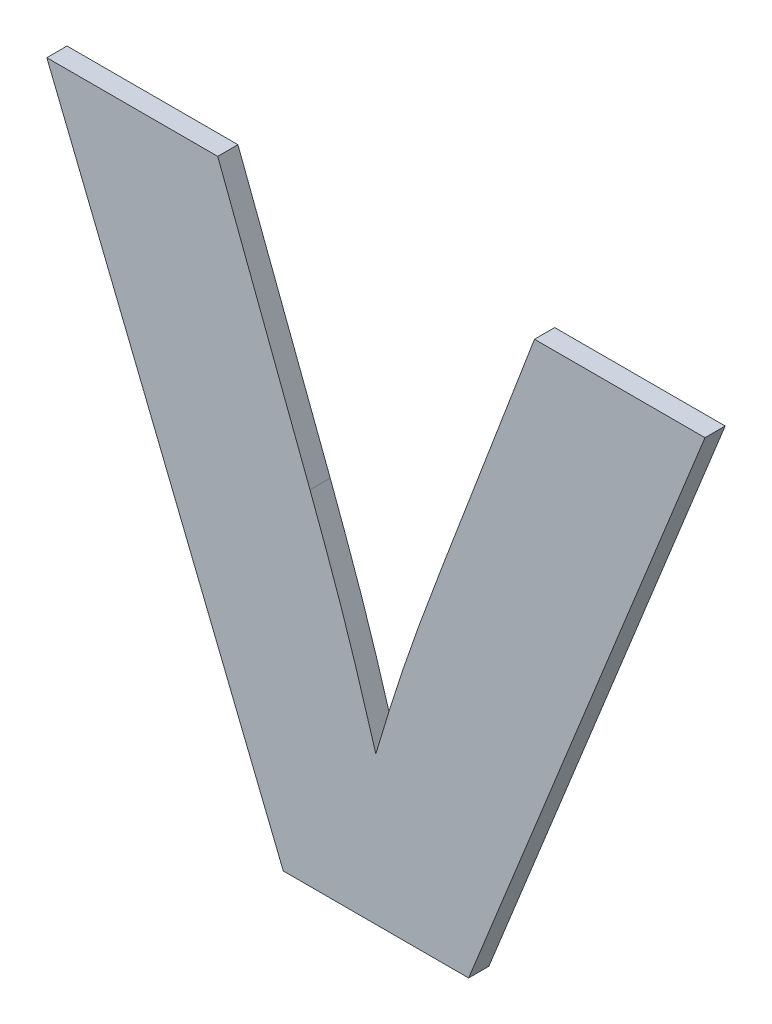
ISO-10303-21;
HEADER;
FILE_DESCRIPTION(('STEP AP214'),'2;1');
FILE_NAME('part.step','',(''),(''),'','','');
FILE_SCHEMA(('AUTOMOTIVE_DESIGN { 1 0 10303 214 1 1 1 1 }'));
ENDSEC;
DATA;
#1=APPLICATION_CONTEXT('core data for automotive mechanical design processes');
#2=APPLICATION_PROTOCOL_DEFINITION('international standard','automotive_design',2000,#1);
#3=PRODUCT_CONTEXT('',#1,'mechanical');
#4=PRODUCT('Part','Part','',(#3));
#5=PRODUCT_RELATED_PRODUCT_CATEGORY('part','',(#4));
#6=PRODUCT_DEFINITION_FORMATION('','',#4);
#7=PRODUCT_DEFINITION_CONTEXT('part definition',#1,'design');
#8=PRODUCT_DEFINITION('design','',#6,#7);
#9=PRODUCT_DEFINITION_SHAPE('','',#8);
#10=(LENGTH_UNIT() NAMED_UNIT(*) SI_UNIT(.MILLI.,.METRE.));
#11=(NAMED_UNIT(*) PLANE_ANGLE_UNIT() SI_UNIT($,.RADIAN.));
#12=(NAMED_UNIT(*) SI_UNIT($,.STERADIAN.) SOLID_ANGLE_UNIT());
#13=UNCERTAINTY_MEASURE_WITH_UNIT(LENGTH_MEASURE(1.E-05),#10,'distance_accuracy_value','');
#14=(GEOMETRIC_REPRESENTATION_CONTEXT(3) GLOBAL_UNCERTAINTY_ASSIGNED_CONTEXT((#13)) GLOBAL_UNIT_ASSIGNED_CONTEXT((#10,
#11,#12)) REPRESENTATION_CONTEXT('',''));
#15=CARTESIAN_POINT('',(0.,0.,0.));
#16=DIRECTION('',(0.,0.,1.));
#17=DIRECTION('',(1.,0.,0.));
#18=AXIS2_PLACEMENT_3D('',#15,#16,#17);
#19=CARTESIAN_POINT('',(-2.48197115384614,-15.,0.5));
#20=DIRECTION('',(0.,1.,0.));
#21=DIRECTION('',(0.,0.,1.));
#22=AXIS2_PLACEMENT_3D('',#19,#20,#21);
#23=PLANE('',#22);
#24=DIRECTION('',(1.,0.,0.));
#25=VECTOR('',#24,1.);
#26=CARTESIAN_POINT('',(-2.48197115384614,-15.,0.));
#27=LINE('',#26,#25);
#28=CARTESIAN_POINT('',(-2.48197115384614,-15.,0.));
#29=VERTEX_POINT('',#28);
#30=CARTESIAN_POINT('',(2.1033653846154,-15.,0.));
#31=VERTEX_POINT('',#30);
#32=EDGE_CURVE('E162',#29,#31,#27,.T.);
#33=ORIENTED_EDGE('',*,*,#32,.T.);
#34=DIRECTION('',(0.,0.,-1.));
#35=VECTOR('',#34,1.);
#36=CARTESIAN_POINT('',(2.1033653846154,-15.,0.5));
#37=LINE('',#36,#35);
#38=CARTESIAN_POINT('',(2.1033653846154,-15.,0.5));
#39=VERTEX_POINT('',#38);
#40=EDGE_CURVE('E136',#39,#31,#37,.T.);
#41=ORIENTED_EDGE('',*,*,#40,.F.);
#42=DIRECTION('',(1.,0.,0.));
#43=VECTOR('',#42,1.);
#44=CARTESIAN_POINT('',(-2.48197115384614,-15.,0.5));
#45=LINE('',#44,#43);
#46=CARTESIAN_POINT('',(-2.48197115384614,-15.,0.5));
#47=VERTEX_POINT('',#46);
#48=EDGE_CURVE('E114',#47,#39,#45,.T.);
#49=ORIENTED_EDGE('',*,*,#48,.F.);
#50=DIRECTION('',(0.,0.,-1.));
#51=VECTOR('',#50,1.);
#52=CARTESIAN_POINT('',(-2.48197115384614,-15.,0.5));
#53=LINE('',#52,#51);
#54=EDGE_CURVE('E129',#47,#29,#53,.T.);
#55=ORIENTED_EDGE('',*,*,#54,.T.);
#56=EDGE_LOOP('',(#33,#41,#49,#55));
#57=FACE_BOUND('',#56,.T.);
#58=ADVANCED_FACE('F39',(#57),#23,.F.);
#59=CARTESIAN_POINT('',(-0.192307692307676,-11.3461538461538,0.5));
#60=CARTESIAN_POINT('',(-0.436283159266334,-10.536029734166,0.5));
#61=CARTESIAN_POINT('',(-0.927732110776665,-8.90416629153097,0.5));
#62=CARTESIAN_POINT('',(-1.52177692105446,-7.30678126442586,0.5));
#63=CARTESIAN_POINT('',(-1.82091346153845,-6.50240384615385,0.5));
#64=B_SPLINE_CURVE_WITH_KNOTS('',3,(#59,#60,#61,#62,#63),.UNSPECIFIED.,.F.,.F.,(4,1,4),(0.,
0.496441118062961,1.),.UNSPECIFIED.);
#65=DIRECTION('',(0.,0.,-1.));
#66=VECTOR('',#65,1.);
#67=SURFACE_OF_LINEAR_EXTRUSION('',#64,#66);
#68=CARTESIAN_POINT('',(-0.192307692307676,-11.3461538461538,0.));
#69=CARTESIAN_POINT('',(-0.436283159266334,-10.536029734166,0.));
#70=CARTESIAN_POINT('',(-0.927732110776665,-8.90416629153097,0.));
#71=CARTESIAN_POINT('',(-1.52177692105446,-7.30678126442586,0.));
#72=CARTESIAN_POINT('',(-1.82091346153845,-6.50240384615385,0.));
#73=B_SPLINE_CURVE_WITH_KNOTS('',3,(#68,#69,#70,#71,#72),.UNSPECIFIED.,.F.,.F.,(4,1,4),(0.,
0.496441118062961,1.),.UNSPECIFIED.);
#74=CARTESIAN_POINT('',(-0.192307692307676,-11.3461538461538,0.));
#75=VERTEX_POINT('',#74);
#76=CARTESIAN_POINT('',(-1.82091346153845,-6.50240384615385,0.));
#77=VERTEX_POINT('',#76);
#78=EDGE_CURVE('E151',#75,#77,#73,.T.);
#79=ORIENTED_EDGE('',*,*,#78,.T.);
#80=DIRECTION('',(0.,0.,-1.));
#81=VECTOR('',#80,1.);
#82=CARTESIAN_POINT('',(-1.82091346153845,-6.50240384615385,0.5));
#83=LINE('',#82,#81);
#84=CARTESIAN_POINT('',(-1.82091346153845,-6.50240384615385,0.5));
#85=VERTEX_POINT('',#84);
#86=EDGE_CURVE('E153',#85,#77,#83,.T.);
#87=ORIENTED_EDGE('',*,*,#86,.F.);
#88=CARTESIAN_POINT('',(-0.192307692307676,-11.3461538461538,0.5));
#89=VERTEX_POINT('',#88);
#90=EDGE_CURVE('E180',#89,#85,#64,.T.);
#91=ORIENTED_EDGE('',*,*,#90,.F.);
#92=DIRECTION('',(0.,0.,-1.));
#93=VECTOR('',#92,1.);
#94=CARTESIAN_POINT('',(-0.192307692307676,-11.3461538461538,0.5));
#95=LINE('',#94,#93);
#96=EDGE_CURVE('E152',#89,#75,#95,.T.);
#97=ORIENTED_EDGE('',*,*,#96,.T.);
#98=EDGE_LOOP('',(#79,#87,#91,#97));
#99=FACE_BOUND('',#98,.T.);
#100=ADVANCED_FACE('F189',(#99),#67,.F.);
#101=CARTESIAN_POINT('',(1.45432692307694,-6.50240384615385,0.5));
#102=CARTESIAN_POINT('',(1.29462311342916,-6.92654798970864,0.5));
#103=CARTESIAN_POINT('',(0.982209524710737,-7.75626140928266,0.5));
#104=CARTESIAN_POINT('',(0.546548526776855,-8.98749923828078,0.5));
#105=CARTESIAN_POINT('',(0.157093822225146,-10.178168976816,0.5));
#106=CARTESIAN_POINT('',(-0.0777034874446245,-10.9630531105388,0.5));
#107=CARTESIAN_POINT('',(-0.192307692307676,-11.3461538461538,0.5));
#108=B_SPLINE_CURVE_WITH_KNOTS('',3,(#101,#102,#103,#104,#105,#106,#107),.UNSPECIFIED.,.F.,.F.,
(4,1,1,1,4),(0.,0.265686788941875,0.519738153970579,0.765584933372219,1.),.UNSPECIFIED.);
#109=DIRECTION('',(0.,0.,-1.));
#110=VECTOR('',#109,1.);
#111=SURFACE_OF_LINEAR_EXTRUSION('',#108,#110);
#112=CARTESIAN_POINT('',(1.45432692307694,-6.50240384615385,0.));
#113=CARTESIAN_POINT('',(1.29462311342916,-6.92654798970864,0.));
#114=CARTESIAN_POINT('',(0.982209524710737,-7.75626140928266,0.));
#115=CARTESIAN_POINT('',(0.546548526776855,-8.98749923828078,0.));
#116=CARTESIAN_POINT('',(0.157093822225146,-10.178168976816,0.));
#117=CARTESIAN_POINT('',(-0.0777034874446245,-10.9630531105388,0.));
#118=CARTESIAN_POINT('',(-0.192307692307676,-11.3461538461538,0.));
#119=B_SPLINE_CURVE_WITH_KNOTS('',3,(#112,#113,#114,#115,#116,#117,#118),.UNSPECIFIED.,.F.,.F.,
(4,1,1,1,4),(0.,0.265686788941875,0.519738153970579,0.765584933372219,1.),.UNSPECIFIED.);
#120=CARTESIAN_POINT('',(1.45432692307694,-6.50240384615385,0.));
#121=VERTEX_POINT('',#120);
#122=EDGE_CURVE('E148',#121,#75,#119,.T.);
#123=ORIENTED_EDGE('',*,*,#122,.T.);
#124=ORIENTED_EDGE('',*,*,#96,.F.);
#125=CARTESIAN_POINT('',(1.45432692307694,-6.50240384615385,0.5));
#126=VERTEX_POINT('',#125);
#127=EDGE_CURVE('E185',#126,#89,#108,.T.);
#128=ORIENTED_EDGE('',*,*,#127,.F.);
#129=DIRECTION('',(0.,0.,-1.));
#130=VECTOR('',#129,1.);
#131=CARTESIAN_POINT('',(1.45432692307694,-6.50240384615385,0.5));
#132=LINE('',#131,#130);
#133=EDGE_CURVE('E147',#126,#121,#132,.T.);
#134=ORIENTED_EDGE('',*,*,#133,.T.);
#135=EDGE_LOOP('',(#123,#124,#128,#134));
#136=FACE_BOUND('',#135,.T.);
#137=ADVANCED_FACE('F191',(#136),#111,.F.);
#138=CARTESIAN_POINT('',(0.579497032906944,-8.90680562357167,0.5));
#139=DIRECTION('',(0.,0.,-1.));
#140=DIRECTION('',(-1.,0.,0.));
#141=AXIS2_PLACEMENT_3D('',#138,#139,#140);
#142=PLANE('',#141);
#143=DIRECTION('',(0.37398380014855,0.927435236135898,0.));
#144=VECTOR('',#143,1.);
#145=CARTESIAN_POINT('',(2.1033653846154,-15.,0.5));
#146=LINE('',#145,#144);
#147=CARTESIAN_POINT('',(7.95042067307694,-0.5,0.5));
#148=VERTEX_POINT('',#147);
#149=EDGE_CURVE('E146',#39,#148,#146,.T.);
#150=ORIENTED_EDGE('',*,*,#149,.T.);
#151=DIRECTION('',(-1.,0.,0.));
#152=VECTOR('',#151,1.);
#153=CARTESIAN_POINT('',(0.579497032906944,-0.5,0.5));
#154=LINE('',#153,#152);
#155=CARTESIAN_POINT('',(3.73248914305372,-0.500000000000001,0.5));
#156=VERTEX_POINT('',#155);
#157=EDGE_CURVE('E128',#148,#156,#154,.T.);
#158=ORIENTED_EDGE('',*,*,#157,.T.);
#159=DIRECTION('',(-0.354843274387437,-0.934925799527429,0.));
#160=VECTOR('',#159,1.);
#161=CARTESIAN_POINT('',(9.61538461538463,15.,0.5));
#162=LINE('',#161,#160);
#163=EDGE_CURVE('E229',#156,#126,#162,.T.);
#164=ORIENTED_EDGE('',*,*,#163,.T.);
#165=ORIENTED_EDGE('',*,*,#127,.T.);
#166=ORIENTED_EDGE('',*,*,#90,.T.);
#167=DIRECTION('',(-0.355528180527443,0.934665562033204,0.));
#168=VECTOR('',#167,1.);
#169=CARTESIAN_POINT('',(-1.82091346153845,-6.50240384615385,0.5));
#170=LINE('',#169,#168);
#171=CARTESIAN_POINT('',(-4.10410844046952,-0.5,0.5));
#172=VERTEX_POINT('',#171);
#173=EDGE_CURVE('E125',#85,#172,#170,.T.);
#174=ORIENTED_EDGE('',*,*,#173,.T.);
#175=CARTESIAN_POINT('',(-8.33193108974358,-0.5,0.5));
#176=VERTEX_POINT('',#175);
#177=EDGE_CURVE('E109',#172,#176,#154,.T.);
#178=ORIENTED_EDGE('',*,*,#177,.T.);
#179=DIRECTION('',(0.37414358328157,-0.927370788352332,0.));
#180=VECTOR('',#179,1.);
#181=CARTESIAN_POINT('',(-14.5853365384615,15.,0.5));
#182=LINE('',#181,#180);
#183=EDGE_CURVE('E123',#176,#47,#182,.T.);
#184=ORIENTED_EDGE('',*,*,#183,.T.);
#185=ORIENTED_EDGE('',*,*,#48,.T.);
#186=EDGE_LOOP('',(#150,#158,#164,#165,#166,#174,#178,#184,#185));
#187=FACE_BOUND('',#186,.T.);
#188=ADVANCED_FACE('F116',(#187),#142,.F.);
#189=CARTESIAN_POINT('',(-14.5853365384615,15.,0.5));
#190=DIRECTION('',(0.927370788352332,0.37414358328157,0.));
#191=DIRECTION('',(-0.37414358328157,0.927370788352333,0.));
#192=AXIS2_PLACEMENT_3D('',#189,#190,#191);
#193=PLANE('',#192);
#194=ORIENTED_EDGE('',*,*,#183,.F.);
#195=DIRECTION('',(0.,0.,-1.));
#196=VECTOR('',#195,1.);
#197=CARTESIAN_POINT('',(-8.33193108974357,-0.5,0.5));
#198=LINE('',#197,#196);
#199=CARTESIAN_POINT('',(-8.33193108974358,-0.499999999999999,0.));
#200=VERTEX_POINT('',#199);
#201=EDGE_CURVE('E101',#176,#200,#198,.T.);
#202=ORIENTED_EDGE('',*,*,#201,.T.);
#203=DIRECTION('',(0.37414358328157,-0.927370788352332,0.));
#204=VECTOR('',#203,1.);
#205=CARTESIAN_POINT('',(-14.5853365384615,15.,0.));
#206=LINE('',#205,#204);
#207=EDGE_CURVE('E111',#200,#29,#206,.T.);
#208=ORIENTED_EDGE('',*,*,#207,.T.);
#209=ORIENTED_EDGE('',*,*,#54,.F.);
#210=EDGE_LOOP('',(#194,#202,#208,#209));
#211=FACE_BOUND('',#210,.T.);
#212=ADVANCED_FACE('F130',(#211),#193,.F.);
#213=CARTESIAN_POINT('',(-1.82091346153845,-6.50240384615385,0.5));
#214=DIRECTION('',(-0.934665562033205,-0.355528180527443,0.));
#215=DIRECTION('',(0.355528180527443,-0.934665562033205,0.));
#216=AXIS2_PLACEMENT_3D('',#213,#214,#215);
#217=PLANE('',#216);
#218=DIRECTION('',(-0.355528180527443,0.934665562033204,0.));
#219=VECTOR('',#218,1.);
#220=CARTESIAN_POINT('',(-1.82091346153845,-6.50240384615385,0.));
#221=LINE('',#220,#219);
#222=CARTESIAN_POINT('',(-4.10410844046952,-0.500000000000001,0.));
#223=VERTEX_POINT('',#222);
#224=EDGE_CURVE('E132',#77,#223,#221,.T.);
#225=ORIENTED_EDGE('',*,*,#224,.T.);
#226=DIRECTION('',(0.,0.,1.));
#227=VECTOR('',#226,1.);
#228=CARTESIAN_POINT('',(-4.10410844046952,-0.5,0.5));
#229=LINE('',#228,#227);
#230=EDGE_CURVE('E159',#223,#172,#229,.T.);
#231=ORIENTED_EDGE('',*,*,#230,.T.);
#232=ORIENTED_EDGE('',*,*,#173,.F.);
#233=ORIENTED_EDGE('',*,*,#86,.T.);
#234=EDGE_LOOP('',(#225,#231,#232,#233));
#235=FACE_BOUND('',#234,.T.);
#236=ADVANCED_FACE('F199',(#235),#217,.F.);
#237=CARTESIAN_POINT('',(9.61538461538463,15.,0.5));
#238=DIRECTION('',(0.934925799527429,-0.354843274387437,0.));
#239=DIRECTION('',(0.354843274387437,0.934925799527429,0.));
#240=AXIS2_PLACEMENT_3D('',#237,#238,#239);
#241=PLANE('',#240);
#242=ORIENTED_EDGE('',*,*,#163,.F.);
#243=DIRECTION('',(0.,0.,-1.));
#244=VECTOR('',#243,1.);
#245=CARTESIAN_POINT('',(3.73248914305372,-0.500000000000002,0.5));
#246=LINE('',#245,#244);
#247=CARTESIAN_POINT('',(3.73248914305372,-0.500000000000002,0.));
#248=VERTEX_POINT('',#247);
#249=EDGE_CURVE('E156',#156,#248,#246,.T.);
#250=ORIENTED_EDGE('',*,*,#249,.T.);
#251=DIRECTION('',(-0.354843274387437,-0.934925799527429,0.));
#252=VECTOR('',#251,1.);
#253=CARTESIAN_POINT('',(9.61538461538463,15.,0.));
#254=LINE('',#253,#252);
#255=EDGE_CURVE('E226',#248,#121,#254,.T.);
#256=ORIENTED_EDGE('',*,*,#255,.T.);
#257=ORIENTED_EDGE('',*,*,#133,.F.);
#258=EDGE_LOOP('',(#242,#250,#256,#257));
#259=FACE_BOUND('',#258,.T.);
#260=ADVANCED_FACE('F198',(#259),#241,.F.);
#261=CARTESIAN_POINT('',(2.1033653846154,-15.,0.5));
#262=DIRECTION('',(-0.927435236135898,0.37398380014855,0.));
#263=DIRECTION('',(-0.37398380014855,-0.927435236135898,0.));
#264=AXIS2_PLACEMENT_3D('',#261,#262,#263);
#265=PLANE('',#264);
#266=DIRECTION('',(0.37398380014855,0.927435236135898,0.));
#267=VECTOR('',#266,1.);
#268=CARTESIAN_POINT('',(2.1033653846154,-15.,0.));
#269=LINE('',#268,#267);
#270=CARTESIAN_POINT('',(7.95042067307694,-0.500000000000002,0.));
#271=VERTEX_POINT('',#270);
#272=EDGE_CURVE('E142',#31,#271,#269,.T.);
#273=ORIENTED_EDGE('',*,*,#272,.T.);
#274=DIRECTION('',(0.,0.,1.));
#275=VECTOR('',#274,1.);
#276=CARTESIAN_POINT('',(7.95042067307694,-0.5,0.5));
#277=LINE('',#276,#275);
#278=EDGE_CURVE('E53',#271,#148,#277,.T.);
#279=ORIENTED_EDGE('',*,*,#278,.T.);
#280=ORIENTED_EDGE('',*,*,#149,.F.);
#281=ORIENTED_EDGE('',*,*,#40,.T.);
#282=EDGE_LOOP('',(#273,#279,#280,#281));
#283=FACE_BOUND('',#282,.T.);
#284=ADVANCED_FACE('F208',(#283),#265,.F.);
#285=CARTESIAN_POINT('',(0.579497032906944,-8.90680562357167,0.));
#286=DIRECTION('',(0.,0.,-1.));
#287=DIRECTION('',(-1.,0.,0.));
#288=AXIS2_PLACEMENT_3D('',#285,#286,#287);
#289=PLANE('',#288);
#290=DIRECTION('',(-1.,0.,0.));
#291=VECTOR('',#290,1.);
#292=CARTESIAN_POINT('',(0.579497032906944,-0.5,0.));
#293=LINE('',#292,#291);
#294=EDGE_CURVE('E11',#271,#248,#293,.T.);
#295=ORIENTED_EDGE('',*,*,#294,.F.);
#296=ORIENTED_EDGE('',*,*,#272,.F.);
#297=ORIENTED_EDGE('',*,*,#32,.F.);
#298=ORIENTED_EDGE('',*,*,#207,.F.);
#299=DIRECTION('',(-1.,0.,0.));
#300=VECTOR('',#299,1.);
#301=CARTESIAN_POINT('',(0.579497032906944,-0.5,0.));
#302=LINE('',#301,#300);
#303=EDGE_CURVE('E48',#223,#200,#302,.T.);
#304=ORIENTED_EDGE('',*,*,#303,.F.);
#305=ORIENTED_EDGE('',*,*,#224,.F.);
#306=ORIENTED_EDGE('',*,*,#78,.F.);
#307=ORIENTED_EDGE('',*,*,#122,.F.);
#308=ORIENTED_EDGE('',*,*,#255,.F.);
#309=EDGE_LOOP('',(#295,#296,#297,#298,#304,#305,#306,#307,#308));
#310=FACE_BOUND('',#309,.T.);
#311=ADVANCED_FACE('F41',(#310),#289,.T.);
#312=CARTESIAN_POINT('',(-17.,-0.5,1.));
#313=DIRECTION('',(0.,-1.,0.));
#314=DIRECTION('',(0.,0.,-1.));
#315=AXIS2_PLACEMENT_3D('',#312,#313,#314);
#316=PLANE('',#315);
#317=ORIENTED_EDGE('',*,*,#303,.T.);
#318=ORIENTED_EDGE('',*,*,#201,.F.);
#319=ORIENTED_EDGE('',*,*,#177,.F.);
#320=ORIENTED_EDGE('',*,*,#230,.F.);
#321=EDGE_LOOP('',(#317,#318,#319,#320));
#322=FACE_BOUND('',#321,.T.);
#323=ADVANCED_FACE('F107',(#322),#316,.F.);
#324=ORIENTED_EDGE('',*,*,#294,.T.);
#325=ORIENTED_EDGE('',*,*,#249,.F.);
#326=ORIENTED_EDGE('',*,*,#157,.F.);
#327=ORIENTED_EDGE('',*,*,#278,.F.);
#328=EDGE_LOOP('',(#324,#325,#326,#327));
#329=FACE_BOUND('',#328,.T.);
#330=ADVANCED_FACE('F204',(#329),#316,.F.);
#331=CLOSED_SHELL('',(#58,#100,#137,#188,#212,#236,#260,#284,#311,#323,#330));
#332=MANIFOLD_SOLID_BREP('B2',#331);
#333=ADVANCED_BREP_SHAPE_REPRESENTATION('',(#18,#332),#14);
#334=SHAPE_DEFINITION_REPRESENTATION(#9,#333);
ENDSEC;
END-ISO-10303-21;
